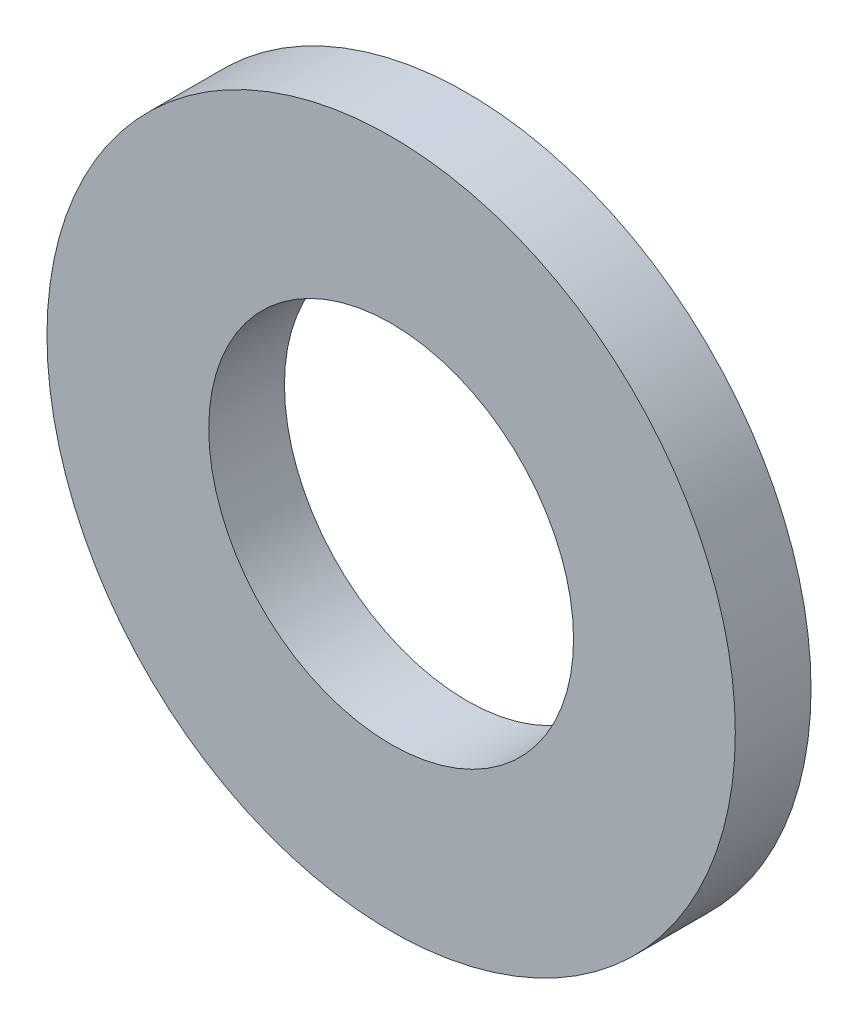
ISO-10303-21;
HEADER;
FILE_DESCRIPTION(('STEP AP214'),'2;1');
FILE_NAME('part.step','',(''),(''),'','','');
FILE_SCHEMA(('AUTOMOTIVE_DESIGN { 1 0 10303 214 1 1 1 1 }'));
ENDSEC;
DATA;
#1=APPLICATION_CONTEXT('core data for automotive mechanical design processes');
#2=APPLICATION_PROTOCOL_DEFINITION('international standard','automotive_design',2000,#1);
#3=PRODUCT_CONTEXT('',#1,'mechanical');
#4=PRODUCT('Part','Part','',(#3));
#5=PRODUCT_RELATED_PRODUCT_CATEGORY('part','',(#4));
#6=PRODUCT_DEFINITION_FORMATION('','',#4);
#7=PRODUCT_DEFINITION_CONTEXT('part definition',#1,'design');
#8=PRODUCT_DEFINITION('design','',#6,#7);
#9=PRODUCT_DEFINITION_SHAPE('','',#8);
#10=(LENGTH_UNIT() NAMED_UNIT(*) SI_UNIT(.MILLI.,.METRE.));
#11=(NAMED_UNIT(*) PLANE_ANGLE_UNIT() SI_UNIT($,.RADIAN.));
#12=(NAMED_UNIT(*) SI_UNIT($,.STERADIAN.) SOLID_ANGLE_UNIT());
#13=UNCERTAINTY_MEASURE_WITH_UNIT(LENGTH_MEASURE(1.E-05),#10,'distance_accuracy_value','');
#14=(GEOMETRIC_REPRESENTATION_CONTEXT(3) GLOBAL_UNCERTAINTY_ASSIGNED_CONTEXT((#13)) GLOBAL_UNIT_ASSIGNED_CONTEXT((#10,
#11,#12)) REPRESENTATION_CONTEXT('',''));
#15=CARTESIAN_POINT('',(0.,0.,0.));
#16=DIRECTION('',(0.,0.,1.));
#17=DIRECTION('',(1.,0.,0.));
#18=AXIS2_PLACEMENT_3D('',#15,#16,#17);
#19=CARTESIAN_POINT('',(0.,0.,1.1));
#20=DIRECTION('',(0.,0.,1.));
#21=DIRECTION('',(1.,0.,0.));
#22=AXIS2_PLACEMENT_3D('',#19,#20,#21);
#23=PLANE('',#22);
#24=CARTESIAN_POINT('',(0.,0.,1.1));
#25=DIRECTION('',(0.,0.,1.));
#26=DIRECTION('',(1.,0.,0.));
#27=AXIS2_PLACEMENT_3D('',#24,#25,#26);
#28=CIRCLE('',#27,5.);
#29=CARTESIAN_POINT('',(5.,0.,1.1));
#30=VERTEX_POINT('',#29);
#31=EDGE_CURVE('E10',#30,#30,#28,.T.);
#32=ORIENTED_EDGE('',*,*,#31,.T.);
#33=EDGE_LOOP('',(#32));
#34=FACE_BOUND('',#33,.T.);
#35=CARTESIAN_POINT('',(0.,0.,1.1));
#36=DIRECTION('',(0.,0.,1.));
#37=DIRECTION('',(1.,0.,0.));
#38=AXIS2_PLACEMENT_3D('',#35,#36,#37);
#39=CIRCLE('',#38,2.65);
#40=CARTESIAN_POINT('',(2.65,0.,1.1));
#41=VERTEX_POINT('',#40);
#42=EDGE_CURVE('E41',#41,#41,#39,.T.);
#43=ORIENTED_EDGE('',*,*,#42,.F.);
#44=EDGE_LOOP('',(#43));
#45=FACE_BOUND('',#44,.T.);
#46=ADVANCED_FACE('F30',(#34,#45),#23,.T.);
#47=CARTESIAN_POINT('',(0.,0.,0.));
#48=DIRECTION('',(0.,0.,1.));
#49=DIRECTION('',(1.,0.,0.));
#50=AXIS2_PLACEMENT_3D('',#47,#48,#49);
#51=PLANE('',#50);
#52=CARTESIAN_POINT('',(0.,0.,0.));
#53=DIRECTION('',(0.,0.,1.));
#54=DIRECTION('',(1.,0.,0.));
#55=AXIS2_PLACEMENT_3D('',#52,#53,#54);
#56=CIRCLE('',#55,5.);
#57=CARTESIAN_POINT('',(5.,0.,0.));
#58=VERTEX_POINT('',#57);
#59=EDGE_CURVE('E34',#58,#58,#56,.T.);
#60=ORIENTED_EDGE('',*,*,#59,.F.);
#61=EDGE_LOOP('',(#60));
#62=FACE_BOUND('',#61,.T.);
#63=CARTESIAN_POINT('',(0.,0.,0.));
#64=DIRECTION('',(0.,0.,1.));
#65=DIRECTION('',(1.,0.,0.));
#66=AXIS2_PLACEMENT_3D('',#63,#64,#65);
#67=CIRCLE('',#66,2.65);
#68=CARTESIAN_POINT('',(2.65,0.,0.));
#69=VERTEX_POINT('',#68);
#70=EDGE_CURVE('E43',#69,#69,#67,.T.);
#71=ORIENTED_EDGE('',*,*,#70,.T.);
#72=EDGE_LOOP('',(#71));
#73=FACE_BOUND('',#72,.T.);
#74=ADVANCED_FACE('F53',(#62,#73),#51,.F.);
#75=CARTESIAN_POINT('',(0.,0.,1.1));
#76=DIRECTION('',(0.,0.,-1.));
#77=DIRECTION('',(-1.,0.,0.));
#78=AXIS2_PLACEMENT_3D('',#75,#76,#77);
#79=CYLINDRICAL_SURFACE('',#78,5.);
#80=ORIENTED_EDGE('',*,*,#31,.F.);
#81=EDGE_LOOP('',(#80));
#82=FACE_BOUND('',#81,.T.);
#83=ORIENTED_EDGE('',*,*,#59,.T.);
#84=EDGE_LOOP('',(#83));
#85=FACE_BOUND('',#84,.T.);
#86=ADVANCED_FACE('F32',(#82,#85),#79,.T.);
#87=CARTESIAN_POINT('',(0.,0.,1.1));
#88=DIRECTION('',(0.,0.,-1.));
#89=DIRECTION('',(-1.,0.,0.));
#90=AXIS2_PLACEMENT_3D('',#87,#88,#89);
#91=CYLINDRICAL_SURFACE('',#90,2.65);
#92=ORIENTED_EDGE('',*,*,#42,.T.);
#93=EDGE_LOOP('',(#92));
#94=FACE_BOUND('',#93,.T.);
#95=ORIENTED_EDGE('',*,*,#70,.F.);
#96=EDGE_LOOP('',(#95));
#97=FACE_BOUND('',#96,.T.);
#98=ADVANCED_FACE('F49',(#94,#97),#91,.F.);
#99=CLOSED_SHELL('',(#46,#74,#86,#98));
#100=MANIFOLD_SOLID_BREP('B2',#99);
#101=ADVANCED_BREP_SHAPE_REPRESENTATION('',(#18,#100),#14);
#102=SHAPE_DEFINITION_REPRESENTATION(#9,#101);
ENDSEC;
END-ISO-10303-21;
